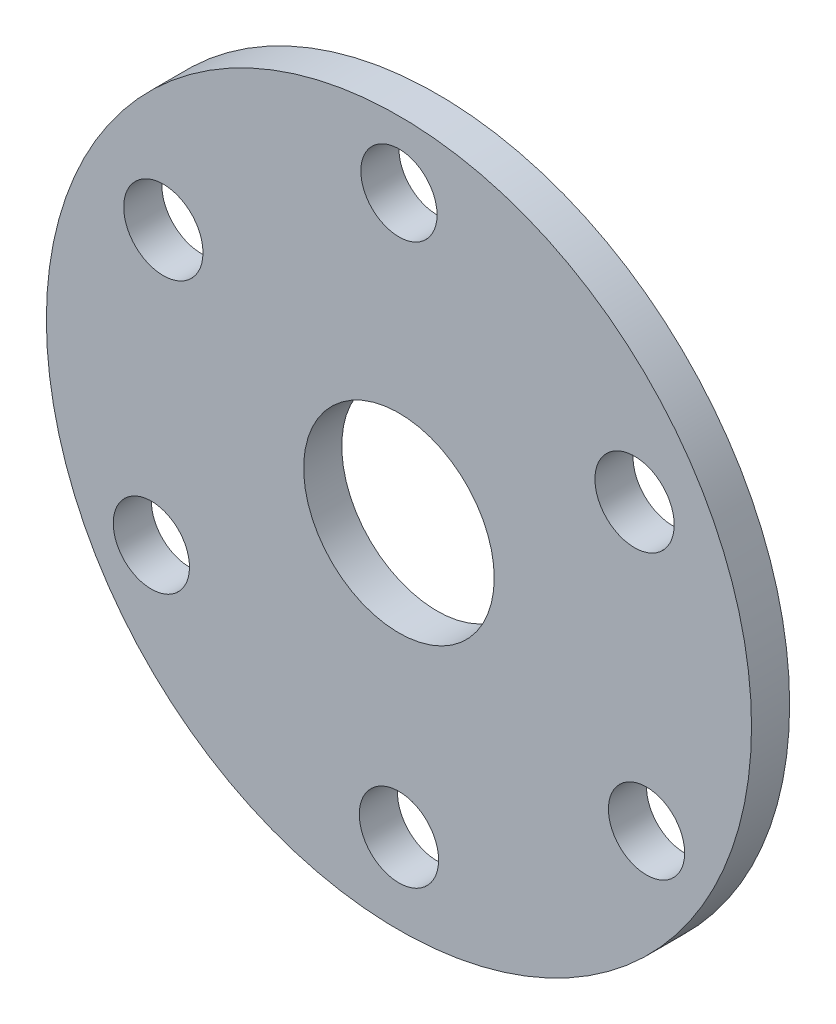
ISO-10303-21;
HEADER;
FILE_DESCRIPTION(('STEP AP214'),'2;1');
FILE_NAME('part.step','',(''),(''),'','','');
FILE_SCHEMA(('AUTOMOTIVE_DESIGN { 1 0 10303 214 1 1 1 1 }'));
ENDSEC;
DATA;
#1=APPLICATION_CONTEXT('core data for automotive mechanical design processes');
#2=APPLICATION_PROTOCOL_DEFINITION('international standard','automotive_design',2000,#1);
#3=PRODUCT_CONTEXT('',#1,'mechanical');
#4=PRODUCT('Part','Part','',(#3));
#5=PRODUCT_RELATED_PRODUCT_CATEGORY('part','',(#4));
#6=PRODUCT_DEFINITION_FORMATION('','',#4);
#7=PRODUCT_DEFINITION_CONTEXT('part definition',#1,'design');
#8=PRODUCT_DEFINITION('design','',#6,#7);
#9=PRODUCT_DEFINITION_SHAPE('','',#8);
#10=(LENGTH_UNIT() NAMED_UNIT(*) SI_UNIT(.MILLI.,.METRE.));
#11=(NAMED_UNIT(*) PLANE_ANGLE_UNIT() SI_UNIT($,.RADIAN.));
#12=(NAMED_UNIT(*) SI_UNIT($,.STERADIAN.) SOLID_ANGLE_UNIT());
#13=UNCERTAINTY_MEASURE_WITH_UNIT(LENGTH_MEASURE(1.E-05),#10,'distance_accuracy_value','');
#14=(GEOMETRIC_REPRESENTATION_CONTEXT(3) GLOBAL_UNCERTAINTY_ASSIGNED_CONTEXT((#13)) GLOBAL_UNIT_ASSIGNED_CONTEXT((#10,
#11,#12)) REPRESENTATION_CONTEXT('',''));
#15=CARTESIAN_POINT('',(0.,0.,0.));
#16=DIRECTION('',(0.,0.,1.));
#17=DIRECTION('',(1.,0.,0.));
#18=AXIS2_PLACEMENT_3D('',#15,#16,#17);
#19=CARTESIAN_POINT('',(0.,0.,2.));
#20=DIRECTION('',(0.,0.,1.));
#21=DIRECTION('',(1.,0.,0.));
#22=AXIS2_PLACEMENT_3D('',#19,#20,#21);
#23=PLANE('',#22);
#24=CARTESIAN_POINT('',(12.3625875403678,7.13754324431372,2.));
#25=DIRECTION('',(0.,0.,1.));
#26=DIRECTION('',(1.,0.,0.));
#27=AXIS2_PLACEMENT_3D('',#24,#25,#26);
#28=CIRCLE('',#27,2.08000000000108);
#29=CARTESIAN_POINT('',(14.4425875403689,7.13754324431372,2.));
#30=VERTEX_POINT('',#29);
#31=EDGE_CURVE('E70',#30,#30,#28,.T.);
#32=ORIENTED_EDGE('',*,*,#31,.F.);
#33=EDGE_LOOP('',(#32));
#34=FACE_BOUND('',#33,.T.);
#35=CARTESIAN_POINT('',(-12.9903810567656,-7.50000000000056,2.));
#36=DIRECTION('',(0.,0.,1.));
#37=DIRECTION('',(1.,0.,0.));
#38=AXIS2_PLACEMENT_3D('',#35,#36,#37);
#39=CIRCLE('',#38,2.00000000000121);
#40=CARTESIAN_POINT('',(-10.9903810567644,-7.50000000000056,2.));
#41=VERTEX_POINT('',#40);
#42=EDGE_CURVE('E58',#41,#41,#39,.T.);
#43=ORIENTED_EDGE('',*,*,#42,.F.);
#44=EDGE_LOOP('',(#43));
#45=FACE_BOUND('',#44,.T.);
#46=CARTESIAN_POINT('',(0.,15.,2.));
#47=DIRECTION('',(0.,0.,1.));
#48=DIRECTION('',(1.,0.,0.));
#49=AXIS2_PLACEMENT_3D('',#46,#47,#48);
#50=CIRCLE('',#49,2.);
#51=CARTESIAN_POINT('',(2.,15.,2.));
#52=VERTEX_POINT('',#51);
#53=EDGE_CURVE('E46',#52,#52,#50,.T.);
#54=ORIENTED_EDGE('',*,*,#53,.F.);
#55=EDGE_LOOP('',(#54));
#56=FACE_BOUND('',#55,.T.);
#57=CARTESIAN_POINT('',(0.,0.,2.));
#58=DIRECTION('',(0.,0.,1.));
#59=DIRECTION('',(1.,0.,0.));
#60=AXIS2_PLACEMENT_3D('',#57,#58,#59);
#61=CIRCLE('',#60,18.5);
#62=CARTESIAN_POINT('',(18.5,0.,2.));
#63=VERTEX_POINT('',#62);
#64=EDGE_CURVE('E10',#63,#63,#61,.T.);
#65=ORIENTED_EDGE('',*,*,#64,.T.);
#66=EDGE_LOOP('',(#65));
#67=FACE_BOUND('',#66,.T.);
#68=CARTESIAN_POINT('',(0.,0.,2.));
#69=DIRECTION('',(0.,0.,1.));
#70=DIRECTION('',(1.,0.,0.));
#71=AXIS2_PLACEMENT_3D('',#68,#69,#70);
#72=CIRCLE('',#71,5.);
#73=CARTESIAN_POINT('',(5.,0.,2.));
#74=VERTEX_POINT('',#73);
#75=EDGE_CURVE('E41',#74,#74,#72,.T.);
#76=ORIENTED_EDGE('',*,*,#75,.F.);
#77=EDGE_LOOP('',(#76));
#78=FACE_BOUND('',#77,.T.);
#79=CARTESIAN_POINT('',(12.9903810567675,-7.49999999999944,2.));
#80=DIRECTION('',(0.,0.,1.));
#81=DIRECTION('',(1.,0.,0.));
#82=AXIS2_PLACEMENT_3D('',#79,#80,#81);
#83=CIRCLE('',#82,2.00000000000083);
#84=CARTESIAN_POINT('',(14.9903810567684,-7.49999999999944,2.));
#85=VERTEX_POINT('',#84);
#86=EDGE_CURVE('E52',#85,#85,#83,.T.);
#87=ORIENTED_EDGE('',*,*,#86,.F.);
#88=EDGE_LOOP('',(#87));
#89=FACE_BOUND('',#88,.T.);
#90=CARTESIAN_POINT('',(-12.3625875403687,7.13754324431114,2.));
#91=DIRECTION('',(0.,0.,1.));
#92=DIRECTION('',(1.,0.,0.));
#93=AXIS2_PLACEMENT_3D('',#90,#91,#92);
#94=CIRCLE('',#93,2.08);
#95=CARTESIAN_POINT('',(-10.2825875403687,7.13754324431114,2.));
#96=VERTEX_POINT('',#95);
#97=EDGE_CURVE('E64',#96,#96,#94,.T.);
#98=ORIENTED_EDGE('',*,*,#97,.F.);
#99=EDGE_LOOP('',(#98));
#100=FACE_BOUND('',#99,.T.);
#101=CARTESIAN_POINT('',(1.7987446555614E-12,-14.2750864886233,2.));
#102=DIRECTION('',(0.,0.,1.));
#103=DIRECTION('',(1.,0.,0.));
#104=AXIS2_PLACEMENT_3D('',#101,#102,#103);
#105=CIRCLE('',#104,2.08000000000041);
#106=CARTESIAN_POINT('',(2.08000000000221,-14.2750864886233,2.));
#107=VERTEX_POINT('',#106);
#108=EDGE_CURVE('E76',#107,#107,#105,.T.);
#109=ORIENTED_EDGE('',*,*,#108,.F.);
#110=EDGE_LOOP('',(#109));
#111=FACE_BOUND('',#110,.T.);
#112=ADVANCED_FACE('F30',(#34,#45,#56,#67,#78,#89,#100,#111),#23,.T.);
#113=CARTESIAN_POINT('',(0.,0.,0.));
#114=DIRECTION('',(0.,0.,1.));
#115=DIRECTION('',(1.,0.,0.));
#116=AXIS2_PLACEMENT_3D('',#113,#114,#115);
#117=PLANE('',#116);
#118=CARTESIAN_POINT('',(0.,0.,0.));
#119=DIRECTION('',(0.,0.,1.));
#120=DIRECTION('',(1.,0.,0.));
#121=AXIS2_PLACEMENT_3D('',#118,#119,#120);
#122=CIRCLE('',#121,18.5);
#123=CARTESIAN_POINT('',(18.5,0.,0.));
#124=VERTEX_POINT('',#123);
#125=EDGE_CURVE('E34',#124,#124,#122,.T.);
#126=ORIENTED_EDGE('',*,*,#125,.F.);
#127=EDGE_LOOP('',(#126));
#128=FACE_BOUND('',#127,.T.);
#129=CARTESIAN_POINT('',(0.,0.,0.));
#130=DIRECTION('',(0.,0.,1.));
#131=DIRECTION('',(1.,0.,0.));
#132=AXIS2_PLACEMENT_3D('',#129,#130,#131);
#133=CIRCLE('',#132,5.);
#134=CARTESIAN_POINT('',(5.,0.,0.));
#135=VERTEX_POINT('',#134);
#136=EDGE_CURVE('E43',#135,#135,#133,.T.);
#137=ORIENTED_EDGE('',*,*,#136,.T.);
#138=EDGE_LOOP('',(#137));
#139=FACE_BOUND('',#138,.T.);
#140=CARTESIAN_POINT('',(0.,15.,0.));
#141=DIRECTION('',(0.,0.,1.));
#142=DIRECTION('',(1.,0.,0.));
#143=AXIS2_PLACEMENT_3D('',#140,#141,#142);
#144=CIRCLE('',#143,2.);
#145=CARTESIAN_POINT('',(2.,15.,0.));
#146=VERTEX_POINT('',#145);
#147=EDGE_CURVE('E49',#146,#146,#144,.T.);
#148=ORIENTED_EDGE('',*,*,#147,.T.);
#149=EDGE_LOOP('',(#148));
#150=FACE_BOUND('',#149,.T.);
#151=CARTESIAN_POINT('',(12.9903810567675,-7.49999999999944,0.));
#152=DIRECTION('',(0.,0.,1.));
#153=DIRECTION('',(1.,0.,0.));
#154=AXIS2_PLACEMENT_3D('',#151,#152,#153);
#155=CIRCLE('',#154,2.00000000000083);
#156=CARTESIAN_POINT('',(14.9903810567684,-7.49999999999944,0.));
#157=VERTEX_POINT('',#156);
#158=EDGE_CURVE('E55',#157,#157,#155,.T.);
#159=ORIENTED_EDGE('',*,*,#158,.T.);
#160=EDGE_LOOP('',(#159));
#161=FACE_BOUND('',#160,.T.);
#162=CARTESIAN_POINT('',(-12.9903810567656,-7.50000000000056,0.));
#163=DIRECTION('',(0.,0.,1.));
#164=DIRECTION('',(1.,0.,0.));
#165=AXIS2_PLACEMENT_3D('',#162,#163,#164);
#166=CIRCLE('',#165,2.00000000000121);
#167=CARTESIAN_POINT('',(-10.9903810567644,-7.50000000000056,0.));
#168=VERTEX_POINT('',#167);
#169=EDGE_CURVE('E61',#168,#168,#166,.T.);
#170=ORIENTED_EDGE('',*,*,#169,.T.);
#171=EDGE_LOOP('',(#170));
#172=FACE_BOUND('',#171,.T.);
#173=CARTESIAN_POINT('',(-12.3625875403687,7.13754324431114,0.));
#174=DIRECTION('',(0.,0.,1.));
#175=DIRECTION('',(1.,0.,0.));
#176=AXIS2_PLACEMENT_3D('',#173,#174,#175);
#177=CIRCLE('',#176,2.08);
#178=CARTESIAN_POINT('',(-10.2825875403687,7.13754324431114,0.));
#179=VERTEX_POINT('',#178);
#180=EDGE_CURVE('E67',#179,#179,#177,.T.);
#181=ORIENTED_EDGE('',*,*,#180,.T.);
#182=EDGE_LOOP('',(#181));
#183=FACE_BOUND('',#182,.T.);
#184=CARTESIAN_POINT('',(12.3625875403678,7.13754324431372,0.));
#185=DIRECTION('',(0.,0.,1.));
#186=DIRECTION('',(1.,0.,0.));
#187=AXIS2_PLACEMENT_3D('',#184,#185,#186);
#188=CIRCLE('',#187,2.08000000000108);
#189=CARTESIAN_POINT('',(14.4425875403689,7.13754324431372,0.));
#190=VERTEX_POINT('',#189);
#191=EDGE_CURVE('E73',#190,#190,#188,.T.);
#192=ORIENTED_EDGE('',*,*,#191,.T.);
#193=EDGE_LOOP('',(#192));
#194=FACE_BOUND('',#193,.T.);
#195=CARTESIAN_POINT('',(1.7987446555614E-12,-14.2750864886233,0.));
#196=DIRECTION('',(0.,0.,1.));
#197=DIRECTION('',(1.,0.,0.));
#198=AXIS2_PLACEMENT_3D('',#195,#196,#197);
#199=CIRCLE('',#198,2.08000000000041);
#200=CARTESIAN_POINT('',(2.08000000000221,-14.2750864886233,0.));
#201=VERTEX_POINT('',#200);
#202=EDGE_CURVE('E79',#201,#201,#199,.T.);
#203=ORIENTED_EDGE('',*,*,#202,.T.);
#204=EDGE_LOOP('',(#203));
#205=FACE_BOUND('',#204,.T.);
#206=ADVANCED_FACE('F89',(#128,#139,#150,#161,#172,#183,#194,#205),#117,.F.);
#207=CARTESIAN_POINT('',(0.,0.,2.));
#208=DIRECTION('',(0.,0.,-1.));
#209=DIRECTION('',(-1.,0.,0.));
#210=AXIS2_PLACEMENT_3D('',#207,#208,#209);
#211=CYLINDRICAL_SURFACE('',#210,18.5);
#212=ORIENTED_EDGE('',*,*,#64,.F.);
#213=EDGE_LOOP('',(#212));
#214=FACE_BOUND('',#213,.T.);
#215=ORIENTED_EDGE('',*,*,#125,.T.);
#216=EDGE_LOOP('',(#215));
#217=FACE_BOUND('',#216,.T.);
#218=ADVANCED_FACE('F32',(#214,#217),#211,.T.);
#219=CARTESIAN_POINT('',(0.,0.,2.));
#220=DIRECTION('',(0.,0.,-1.));
#221=DIRECTION('',(-1.,0.,0.));
#222=AXIS2_PLACEMENT_3D('',#219,#220,#221);
#223=CYLINDRICAL_SURFACE('',#222,5.);
#224=ORIENTED_EDGE('',*,*,#75,.T.);
#225=EDGE_LOOP('',(#224));
#226=FACE_BOUND('',#225,.T.);
#227=ORIENTED_EDGE('',*,*,#136,.F.);
#228=EDGE_LOOP('',(#227));
#229=FACE_BOUND('',#228,.T.);
#230=ADVANCED_FACE('F99',(#226,#229),#223,.F.);
#231=CARTESIAN_POINT('',(0.,15.,2.));
#232=DIRECTION('',(0.,0.,-1.));
#233=DIRECTION('',(-1.,0.,0.));
#234=AXIS2_PLACEMENT_3D('',#231,#232,#233);
#235=CYLINDRICAL_SURFACE('',#234,2.);
#236=ORIENTED_EDGE('',*,*,#53,.T.);
#237=EDGE_LOOP('',(#236));
#238=FACE_BOUND('',#237,.T.);
#239=ORIENTED_EDGE('',*,*,#147,.F.);
#240=EDGE_LOOP('',(#239));
#241=FACE_BOUND('',#240,.T.);
#242=ADVANCED_FACE('F102',(#238,#241),#235,.F.);
#243=CARTESIAN_POINT('',(12.9903810567675,-7.49999999999944,2.));
#244=DIRECTION('',(0.,0.,-1.));
#245=DIRECTION('',(-1.,0.,0.));
#246=AXIS2_PLACEMENT_3D('',#243,#244,#245);
#247=CYLINDRICAL_SURFACE('',#246,2.00000000000083);
#248=ORIENTED_EDGE('',*,*,#86,.T.);
#249=EDGE_LOOP('',(#248));
#250=FACE_BOUND('',#249,.T.);
#251=ORIENTED_EDGE('',*,*,#158,.F.);
#252=EDGE_LOOP('',(#251));
#253=FACE_BOUND('',#252,.T.);
#254=ADVANCED_FACE('F106',(#250,#253),#247,.F.);
#255=CARTESIAN_POINT('',(-12.9903810567656,-7.50000000000056,2.));
#256=DIRECTION('',(0.,0.,-1.));
#257=DIRECTION('',(-1.,0.,0.));
#258=AXIS2_PLACEMENT_3D('',#255,#256,#257);
#259=CYLINDRICAL_SURFACE('',#258,2.00000000000121);
#260=ORIENTED_EDGE('',*,*,#42,.T.);
#261=EDGE_LOOP('',(#260));
#262=FACE_BOUND('',#261,.T.);
#263=ORIENTED_EDGE('',*,*,#169,.F.);
#264=EDGE_LOOP('',(#263));
#265=FACE_BOUND('',#264,.T.);
#266=ADVANCED_FACE('F110',(#262,#265),#259,.F.);
#267=CARTESIAN_POINT('',(-12.3625875403687,7.13754324431114,2.));
#268=DIRECTION('',(0.,0.,-1.));
#269=DIRECTION('',(-1.,0.,0.));
#270=AXIS2_PLACEMENT_3D('',#267,#268,#269);
#271=CYLINDRICAL_SURFACE('',#270,2.08);
#272=ORIENTED_EDGE('',*,*,#97,.T.);
#273=EDGE_LOOP('',(#272));
#274=FACE_BOUND('',#273,.T.);
#275=ORIENTED_EDGE('',*,*,#180,.F.);
#276=EDGE_LOOP('',(#275));
#277=FACE_BOUND('',#276,.T.);
#278=ADVANCED_FACE('F114',(#274,#277),#271,.F.);
#279=CARTESIAN_POINT('',(12.3625875403678,7.13754324431372,2.));
#280=DIRECTION('',(0.,0.,-1.));
#281=DIRECTION('',(-1.,0.,0.));
#282=AXIS2_PLACEMENT_3D('',#279,#280,#281);
#283=CYLINDRICAL_SURFACE('',#282,2.08000000000108);
#284=ORIENTED_EDGE('',*,*,#31,.T.);
#285=EDGE_LOOP('',(#284));
#286=FACE_BOUND('',#285,.T.);
#287=ORIENTED_EDGE('',*,*,#191,.F.);
#288=EDGE_LOOP('',(#287));
#289=FACE_BOUND('',#288,.T.);
#290=ADVANCED_FACE('F118',(#286,#289),#283,.F.);
#291=CARTESIAN_POINT('',(1.7987446555614E-12,-14.2750864886233,2.));
#292=DIRECTION('',(0.,0.,-1.));
#293=DIRECTION('',(-1.,0.,0.));
#294=AXIS2_PLACEMENT_3D('',#291,#292,#293);
#295=CYLINDRICAL_SURFACE('',#294,2.08000000000041);
#296=ORIENTED_EDGE('',*,*,#108,.T.);
#297=EDGE_LOOP('',(#296));
#298=FACE_BOUND('',#297,.T.);
#299=ORIENTED_EDGE('',*,*,#202,.F.);
#300=EDGE_LOOP('',(#299));
#301=FACE_BOUND('',#300,.T.);
#302=ADVANCED_FACE('F85',(#298,#301),#295,.F.);
#303=CLOSED_SHELL('',(#112,#206,#218,#230,#242,#254,#266,#278,#290,#302));
#304=MANIFOLD_SOLID_BREP('B2',#303);
#305=ADVANCED_BREP_SHAPE_REPRESENTATION('',(#18,#304),#14);
#306=SHAPE_DEFINITION_REPRESENTATION(#9,#305);
ENDSEC;
END-ISO-10303-21;
